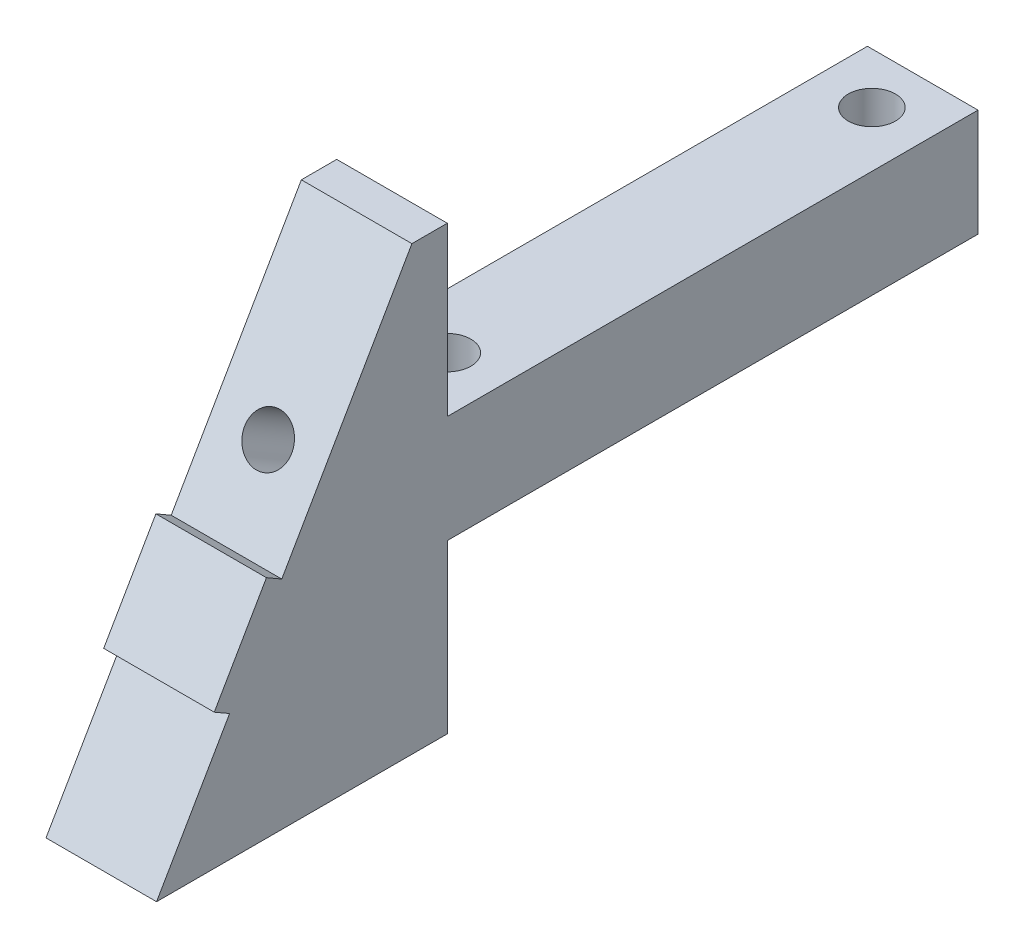
ISO-10303-21;
HEADER;
FILE_DESCRIPTION(('STEP AP214'),'2;1');
FILE_NAME('part.step','',(''),(''),'','','');
FILE_SCHEMA(('AUTOMOTIVE_DESIGN { 1 0 10303 214 1 1 1 1 }'));
ENDSEC;
DATA;
#1=APPLICATION_CONTEXT('core data for automotive mechanical design processes');
#2=APPLICATION_PROTOCOL_DEFINITION('international standard','automotive_design',2000,#1);
#3=PRODUCT_CONTEXT('',#1,'mechanical');
#4=PRODUCT('Part','Part','',(#3));
#5=PRODUCT_RELATED_PRODUCT_CATEGORY('part','',(#4));
#6=PRODUCT_DEFINITION_FORMATION('','',#4);
#7=PRODUCT_DEFINITION_CONTEXT('part definition',#1,'design');
#8=PRODUCT_DEFINITION('design','',#6,#7);
#9=PRODUCT_DEFINITION_SHAPE('','',#8);
#10=(LENGTH_UNIT() NAMED_UNIT(*) SI_UNIT(.MILLI.,.METRE.));
#11=(NAMED_UNIT(*) PLANE_ANGLE_UNIT() SI_UNIT($,.RADIAN.));
#12=(NAMED_UNIT(*) SI_UNIT($,.STERADIAN.) SOLID_ANGLE_UNIT());
#13=UNCERTAINTY_MEASURE_WITH_UNIT(LENGTH_MEASURE(1.E-05),#10,'distance_accuracy_value','');
#14=(GEOMETRIC_REPRESENTATION_CONTEXT(3) GLOBAL_UNCERTAINTY_ASSIGNED_CONTEXT((#13)) GLOBAL_UNIT_ASSIGNED_CONTEXT((#10,
#11,#12)) REPRESENTATION_CONTEXT('',''));
#15=CARTESIAN_POINT('',(0.,0.,0.));
#16=DIRECTION('',(0.,0.,1.));
#17=DIRECTION('',(1.,0.,0.));
#18=AXIS2_PLACEMENT_3D('',#15,#16,#17);
#19=CARTESIAN_POINT('',(0.,0.,-30.48));
#20=DIRECTION('',(0.,0.,-1.));
#21=DIRECTION('',(-1.,0.,0.));
#22=AXIS2_PLACEMENT_3D('',#19,#20,#21);
#23=PLANE('',#22);
#24=DIRECTION('',(0.,-1.,0.));
#25=VECTOR('',#24,1.);
#26=CARTESIAN_POINT('',(6.35,15.875,-30.48));
#27=LINE('',#26,#25);
#28=CARTESIAN_POINT('',(6.35,15.7861,-30.48));
#29=VERTEX_POINT('',#28);
#30=CARTESIAN_POINT('',(6.35,9.6139,-30.48));
#31=VERTEX_POINT('',#30);
#32=EDGE_CURVE('E178',#29,#31,#27,.T.);
#33=ORIENTED_EDGE('',*,*,#32,.T.);
#34=DIRECTION('',(1.,0.,0.));
#35=VECTOR('',#34,1.);
#36=CARTESIAN_POINT('',(6.35,9.6139,-30.48));
#37=LINE('',#36,#35);
#38=CARTESIAN_POINT('',(0.,9.6139,-30.48));
#39=VERTEX_POINT('',#38);
#40=EDGE_CURVE('E199',#39,#31,#37,.T.);
#41=ORIENTED_EDGE('',*,*,#40,.F.);
#42=DIRECTION('',(0.,1.,0.));
#43=VECTOR('',#42,1.);
#44=CARTESIAN_POINT('',(0.,15.875,-30.48));
#45=LINE('',#44,#43);
#46=CARTESIAN_POINT('',(0.,15.7861,-30.48));
#47=VERTEX_POINT('',#46);
#48=EDGE_CURVE('E181',#39,#47,#45,.T.);
#49=ORIENTED_EDGE('',*,*,#48,.T.);
#50=DIRECTION('',(-1.,0.,0.));
#51=VECTOR('',#50,1.);
#52=CARTESIAN_POINT('',(0.,15.7861,-30.48));
#53=LINE('',#52,#51);
#54=EDGE_CURVE('E218',#29,#47,#53,.T.);
#55=ORIENTED_EDGE('',*,*,#54,.F.);
#56=EDGE_LOOP('',(#33,#41,#49,#55));
#57=FACE_BOUND('',#56,.T.);
#58=ADVANCED_FACE('F39',(#57),#23,.T.);
#59=CARTESIAN_POINT('',(3.175,15.875,-27.559));
#60=DIRECTION('',(0.,1.,0.));
#61=DIRECTION('',(0.,0.,1.));
#62=AXIS2_PLACEMENT_3D('',#59,#60,#61);
#63=CYLINDRICAL_SURFACE('',#62,1.35254999999999);
#64=CARTESIAN_POINT('',(3.175,15.7861,-27.559));
#65=DIRECTION('',(0.,1.,0.));
#66=DIRECTION('',(0.,0.,1.));
#67=AXIS2_PLACEMENT_3D('',#64,#65,#66);
#68=CIRCLE('',#67,1.35254999999999);
#69=CARTESIAN_POINT('',(3.175,15.7861,-26.20645));
#70=VERTEX_POINT('',#69);
#71=EDGE_CURVE('E221',#70,#70,#68,.F.);
#72=ORIENTED_EDGE('',*,*,#71,.F.);
#73=EDGE_LOOP('',(#72));
#74=FACE_BOUND('',#73,.T.);
#75=CARTESIAN_POINT('',(3.175,9.6139,-27.559));
#76=DIRECTION('',(0.,-1.,0.));
#77=DIRECTION('',(0.,0.,-1.));
#78=AXIS2_PLACEMENT_3D('',#75,#76,#77);
#79=CIRCLE('',#78,1.35254999999999);
#80=CARTESIAN_POINT('',(3.175,9.6139,-28.91155));
#81=VERTEX_POINT('',#80);
#82=EDGE_CURVE('E206',#81,#81,#79,.F.);
#83=ORIENTED_EDGE('',*,*,#82,.F.);
#84=EDGE_LOOP('',(#83));
#85=FACE_BOUND('',#84,.T.);
#86=ADVANCED_FACE('F249',(#74,#85),#63,.F.);
#87=CARTESIAN_POINT('',(3.175,15.875,-3.175));
#88=DIRECTION('',(0.,1.,0.));
#89=DIRECTION('',(0.,0.,1.));
#90=AXIS2_PLACEMENT_3D('',#87,#88,#89);
#91=CYLINDRICAL_SURFACE('',#90,1.35254999999999);
#92=CARTESIAN_POINT('',(3.175,15.7861,-3.175));
#93=DIRECTION('',(0.,1.,0.));
#94=DIRECTION('',(0.,0.,1.));
#95=AXIS2_PLACEMENT_3D('',#92,#93,#94);
#96=CIRCLE('',#95,1.35254999999999);
#97=CARTESIAN_POINT('',(3.175,15.7861,-1.82245000000001));
#98=VERTEX_POINT('',#97);
#99=EDGE_CURVE('E43',#98,#98,#96,.F.);
#100=ORIENTED_EDGE('',*,*,#99,.F.);
#101=EDGE_LOOP('',(#100));
#102=FACE_BOUND('',#101,.T.);
#103=CARTESIAN_POINT('',(3.175,9.6139,-3.175));
#104=DIRECTION('',(0.,-1.,0.));
#105=DIRECTION('',(0.,0.,-1.));
#106=AXIS2_PLACEMENT_3D('',#103,#104,#105);
#107=CIRCLE('',#106,1.35254999999999);
#108=CARTESIAN_POINT('',(3.175,9.6139,-4.52754999999999));
#109=VERTEX_POINT('',#108);
#110=EDGE_CURVE('E203',#109,#109,#107,.F.);
#111=ORIENTED_EDGE('',*,*,#110,.F.);
#112=EDGE_LOOP('',(#111));
#113=FACE_BOUND('',#112,.T.);
#114=ADVANCED_FACE('F256',(#102,#113),#91,.F.);
#115=CARTESIAN_POINT('',(6.35,25.4,2.032));
#116=DIRECTION('',(0.,-0.499999999999995,-0.866025403784442));
#117=DIRECTION('',(0.,0.866025403784442,-0.499999999999995));
#118=AXIS2_PLACEMENT_3D('',#115,#116,#117);
#119=PLANE('',#118);
#120=DIRECTION('',(0.,-0.866025403784442,0.499999999999995));
#121=VECTOR('',#120,1.);
#122=CARTESIAN_POINT('',(6.35,25.4,2.032));
#123=LINE('',#122,#121);
#124=CARTESIAN_POINT('',(6.35,7.26343618632508,12.5031499999999));
#125=VERTEX_POINT('',#124);
#126=CARTESIAN_POINT('',(6.35,0.,16.6966968374163));
#127=VERTEX_POINT('',#126);
#128=EDGE_CURVE('E154',#125,#127,#123,.T.);
#129=ORIENTED_EDGE('',*,*,#128,.F.);
#130=DIRECTION('',(1.,0.,0.));
#131=VECTOR('',#130,1.);
#132=CARTESIAN_POINT('',(0.,7.26343618632508,12.5031499999999));
#133=LINE('',#132,#131);
#134=CARTESIAN_POINT('',(0.,7.26343618632508,12.5031499999999));
#135=VERTEX_POINT('',#134);
#136=EDGE_CURVE('E152',#135,#125,#133,.T.);
#137=ORIENTED_EDGE('',*,*,#136,.F.);
#138=DIRECTION('',(0.,-0.866025403784442,0.499999999999995));
#139=VECTOR('',#138,1.);
#140=CARTESIAN_POINT('',(0.,25.4,2.032));
#141=LINE('',#140,#139);
#142=CARTESIAN_POINT('',(0.,0.,16.6966968374163));
#143=VERTEX_POINT('',#142);
#144=EDGE_CURVE('E136',#135,#143,#141,.T.);
#145=ORIENTED_EDGE('',*,*,#144,.T.);
#146=DIRECTION('',(-1.,0.,0.));
#147=VECTOR('',#146,1.);
#148=CARTESIAN_POINT('',(6.35,0.,16.6966968374163));
#149=LINE('',#148,#147);
#150=EDGE_CURVE('E323',#127,#143,#149,.T.);
#151=ORIENTED_EDGE('',*,*,#150,.F.);
#152=EDGE_LOOP('',(#129,#137,#145,#151));
#153=FACE_BOUND('',#152,.T.);
#154=ADVANCED_FACE('F153',(#153),#119,.F.);
#155=CARTESIAN_POINT('',(3.175,16.6011818975501,7.11199999999995));
#156=DIRECTION('',(0.,0.499999999999995,0.866025403784442));
#157=DIRECTION('',(0.,-0.866025403784442,0.499999999999995));
#158=AXIS2_PLACEMENT_3D('',#155,#156,#157);
#159=CIRCLE('',#158,1.35254999999999);
#160=CARTESIAN_POINT('',(3.175,15.4298392376614,7.78827499999993));
#161=VERTEX_POINT('',#160);
#162=EDGE_CURVE('E223',#161,#161,#159,.T.);
#163=ORIENTED_EDGE('',*,*,#162,.F.);
#164=EDGE_LOOP('',(#163));
#165=FACE_BOUND('',#164,.T.);
#166=CARTESIAN_POINT('',(0.,25.4,2.032));
#167=VERTEX_POINT('',#166);
#168=CARTESIAN_POINT('',(0.,12.4547388667705,9.50594999999992));
#169=VERTEX_POINT('',#168);
#170=EDGE_CURVE('E149',#167,#169,#141,.T.);
#171=ORIENTED_EDGE('',*,*,#170,.T.);
#172=DIRECTION('',(-1.,0.,0.));
#173=VECTOR('',#172,1.);
#174=CARTESIAN_POINT('',(6.35,12.4547388667705,9.50594999999992));
#175=LINE('',#174,#173);
#176=CARTESIAN_POINT('',(6.35,12.4547388667705,9.50594999999992));
#177=VERTEX_POINT('',#176);
#178=EDGE_CURVE('E341',#177,#169,#175,.T.);
#179=ORIENTED_EDGE('',*,*,#178,.F.);
#180=CARTESIAN_POINT('',(6.35,25.4,2.032));
#181=VERTEX_POINT('',#180);
#182=EDGE_CURVE('E327',#181,#177,#123,.T.);
#183=ORIENTED_EDGE('',*,*,#182,.F.);
#184=DIRECTION('',(-1.,0.,0.));
#185=VECTOR('',#184,1.);
#186=CARTESIAN_POINT('',(6.35,25.4,2.032));
#187=LINE('',#186,#185);
#188=EDGE_CURVE('E326',#181,#167,#187,.T.);
#189=ORIENTED_EDGE('',*,*,#188,.T.);
#190=EDGE_LOOP('',(#171,#179,#183,#189));
#191=FACE_BOUND('',#190,.T.);
#192=ADVANCED_FACE('F269',(#165,#191),#119,.F.);
#193=CARTESIAN_POINT('',(6.35,0.,0.));
#194=DIRECTION('',(0.,0.,1.));
#195=DIRECTION('',(1.,0.,0.));
#196=AXIS2_PLACEMENT_3D('',#193,#194,#195);
#197=PLANE('',#196);
#198=DIRECTION('',(0.,1.,0.));
#199=VECTOR('',#198,1.);
#200=CARTESIAN_POINT('',(6.35,0.,0.));
#201=LINE('',#200,#199);
#202=CARTESIAN_POINT('',(6.35,15.7861,0.));
#203=VERTEX_POINT('',#202);
#204=CARTESIAN_POINT('',(6.35,25.4,0.));
#205=VERTEX_POINT('',#204);
#206=EDGE_CURVE('E284',#203,#205,#201,.T.);
#207=ORIENTED_EDGE('',*,*,#206,.F.);
#208=DIRECTION('',(1.,0.,0.));
#209=VECTOR('',#208,1.);
#210=CARTESIAN_POINT('',(0.,15.7861,0.));
#211=LINE('',#210,#209);
#212=CARTESIAN_POINT('',(0.,15.7861,0.));
#213=VERTEX_POINT('',#212);
#214=EDGE_CURVE('E213',#213,#203,#211,.T.);
#215=ORIENTED_EDGE('',*,*,#214,.F.);
#216=DIRECTION('',(0.,1.,0.));
#217=VECTOR('',#216,1.);
#218=CARTESIAN_POINT('',(0.,0.,0.));
#219=LINE('',#218,#217);
#220=CARTESIAN_POINT('',(0.,25.4,0.));
#221=VERTEX_POINT('',#220);
#222=EDGE_CURVE('E301',#213,#221,#219,.T.);
#223=ORIENTED_EDGE('',*,*,#222,.T.);
#224=DIRECTION('',(-1.,0.,0.));
#225=VECTOR('',#224,1.);
#226=CARTESIAN_POINT('',(6.35,25.4,0.));
#227=LINE('',#226,#225);
#228=EDGE_CURVE('E48',#205,#221,#227,.T.);
#229=ORIENTED_EDGE('',*,*,#228,.F.);
#230=EDGE_LOOP('',(#207,#215,#223,#229));
#231=FACE_BOUND('',#230,.T.);
#232=ADVANCED_FACE('F272',(#231),#197,.F.);
#233=CARTESIAN_POINT('',(0.,0.,0.));
#234=VERTEX_POINT('',#233);
#235=CARTESIAN_POINT('',(0.,9.6139,0.));
#236=VERTEX_POINT('',#235);
#237=EDGE_CURVE('E304',#234,#236,#219,.T.);
#238=ORIENTED_EDGE('',*,*,#237,.T.);
#239=DIRECTION('',(-1.,0.,0.));
#240=VECTOR('',#239,1.);
#241=CARTESIAN_POINT('',(6.35,9.6139,0.));
#242=LINE('',#241,#240);
#243=CARTESIAN_POINT('',(6.35,9.6139,0.));
#244=VERTEX_POINT('',#243);
#245=EDGE_CURVE('E200',#244,#236,#242,.T.);
#246=ORIENTED_EDGE('',*,*,#245,.F.);
#247=CARTESIAN_POINT('',(6.35,0.,0.));
#248=VERTEX_POINT('',#247);
#249=EDGE_CURVE('E288',#248,#244,#201,.T.);
#250=ORIENTED_EDGE('',*,*,#249,.F.);
#251=DIRECTION('',(-1.,0.,0.));
#252=VECTOR('',#251,1.);
#253=CARTESIAN_POINT('',(6.35,0.,0.));
#254=LINE('',#253,#252);
#255=EDGE_CURVE('E12',#248,#234,#254,.T.);
#256=ORIENTED_EDGE('',*,*,#255,.T.);
#257=EDGE_LOOP('',(#238,#246,#250,#256));
#258=FACE_BOUND('',#257,.T.);
#259=ADVANCED_FACE('F274',(#258),#197,.F.);
#260=CARTESIAN_POINT('',(6.35,0.,16.6966968374163));
#261=DIRECTION('',(0.,1.,0.));
#262=DIRECTION('',(0.,0.,1.));
#263=AXIS2_PLACEMENT_3D('',#260,#261,#262);
#264=PLANE('',#263);
#265=DIRECTION('',(0.,0.,-1.));
#266=VECTOR('',#265,1.);
#267=CARTESIAN_POINT('',(0.,0.,16.6966968374163));
#268=LINE('',#267,#266);
#269=EDGE_CURVE('E144',#143,#234,#268,.T.);
#270=ORIENTED_EDGE('',*,*,#269,.T.);
#271=ORIENTED_EDGE('',*,*,#255,.F.);
#272=DIRECTION('',(0.,0.,-1.));
#273=VECTOR('',#272,1.);
#274=CARTESIAN_POINT('',(6.35,0.,16.6966968374163));
#275=LINE('',#274,#273);
#276=EDGE_CURVE('E185',#127,#248,#275,.T.);
#277=ORIENTED_EDGE('',*,*,#276,.F.);
#278=ORIENTED_EDGE('',*,*,#150,.T.);
#279=EDGE_LOOP('',(#270,#271,#277,#278));
#280=FACE_BOUND('',#279,.T.);
#281=ADVANCED_FACE('F41',(#280),#264,.F.);
#282=CARTESIAN_POINT('',(6.35,25.4,0.));
#283=DIRECTION('',(0.,-1.,0.));
#284=DIRECTION('',(0.,0.,-1.));
#285=AXIS2_PLACEMENT_3D('',#282,#283,#284);
#286=PLANE('',#285);
#287=DIRECTION('',(0.,0.,1.));
#288=VECTOR('',#287,1.);
#289=CARTESIAN_POINT('',(0.,25.4,0.));
#290=LINE('',#289,#288);
#291=EDGE_CURVE('E150',#221,#167,#290,.T.);
#292=ORIENTED_EDGE('',*,*,#291,.T.);
#293=ORIENTED_EDGE('',*,*,#188,.F.);
#294=DIRECTION('',(0.,0.,1.));
#295=VECTOR('',#294,1.);
#296=CARTESIAN_POINT('',(6.35,25.4,0.));
#297=LINE('',#296,#295);
#298=EDGE_CURVE('E331',#205,#181,#297,.T.);
#299=ORIENTED_EDGE('',*,*,#298,.F.);
#300=ORIENTED_EDGE('',*,*,#228,.T.);
#301=EDGE_LOOP('',(#292,#293,#299,#300));
#302=FACE_BOUND('',#301,.T.);
#303=ADVANCED_FACE('F263',(#302),#286,.F.);
#304=CARTESIAN_POINT('',(6.35,0.,0.));
#305=DIRECTION('',(1.,0.,0.));
#306=DIRECTION('',(0.,0.,-1.));
#307=AXIS2_PLACEMENT_3D('',#304,#305,#306);
#308=PLANE('',#307);
#309=DIRECTION('',(0.,0.499999999999995,0.866025403784441));
#310=VECTOR('',#309,1.);
#311=CARTESIAN_POINT('',(6.35,7.26343618632508,12.5031499999999));
#312=LINE('',#311,#310);
#313=CARTESIAN_POINT('',(6.35,7.77143618632508,13.3830318102449));
#314=VERTEX_POINT('',#313);
#315=EDGE_CURVE('E56',#125,#314,#312,.T.);
#316=ORIENTED_EDGE('',*,*,#315,.F.);
#317=ORIENTED_EDGE('',*,*,#128,.T.);
#318=ORIENTED_EDGE('',*,*,#276,.T.);
#319=ORIENTED_EDGE('',*,*,#249,.T.);
#320=DIRECTION('',(0.,0.,1.));
#321=VECTOR('',#320,1.);
#322=CARTESIAN_POINT('',(6.35,9.6139,-30.48));
#323=LINE('',#322,#321);
#324=EDGE_CURVE('E296',#31,#244,#323,.T.);
#325=ORIENTED_EDGE('',*,*,#324,.F.);
#326=ORIENTED_EDGE('',*,*,#32,.F.);
#327=DIRECTION('',(0.,0.,-1.));
#328=VECTOR('',#327,1.);
#329=CARTESIAN_POINT('',(6.35,15.7861,-30.48));
#330=LINE('',#329,#328);
#331=EDGE_CURVE('E216',#203,#29,#330,.T.);
#332=ORIENTED_EDGE('',*,*,#331,.F.);
#333=ORIENTED_EDGE('',*,*,#206,.T.);
#334=ORIENTED_EDGE('',*,*,#298,.T.);
#335=ORIENTED_EDGE('',*,*,#182,.T.);
#336=DIRECTION('',(0.,-0.499999999999994,-0.866025403784442));
#337=VECTOR('',#336,1.);
#338=CARTESIAN_POINT('',(6.35,12.4547388667705,9.50594999999992));
#339=LINE('',#338,#337);
#340=CARTESIAN_POINT('',(6.35,12.9627388667705,10.3858318102449));
#341=VERTEX_POINT('',#340);
#342=EDGE_CURVE('E339',#341,#177,#339,.T.);
#343=ORIENTED_EDGE('',*,*,#342,.F.);
#344=DIRECTION('',(0.,0.866025403784442,-0.499999999999995));
#345=VECTOR('',#344,1.);
#346=CARTESIAN_POINT('',(6.35,13.039728525167,10.3413818102449));
#347=LINE('',#346,#345);
#348=EDGE_CURVE('E174',#314,#341,#347,.T.);
#349=ORIENTED_EDGE('',*,*,#348,.F.);
#350=EDGE_LOOP('',(#316,#317,#318,#319,#325,#326,#332,#333,#334,#335,#343,#349));
#351=FACE_BOUND('',#350,.T.);
#352=ADVANCED_FACE('F260',(#351),#308,.T.);
#353=CARTESIAN_POINT('',(0.,0.,0.));
#354=DIRECTION('',(1.,0.,0.));
#355=DIRECTION('',(0.,0.,-1.));
#356=AXIS2_PLACEMENT_3D('',#353,#354,#355);
#357=PLANE('',#356);
#358=ORIENTED_EDGE('',*,*,#144,.F.);
#359=DIRECTION('',(0.,-0.499999999999995,-0.866025403784441));
#360=VECTOR('',#359,1.);
#361=CARTESIAN_POINT('',(0.,7.26343618632508,12.5031499999999));
#362=LINE('',#361,#360);
#363=CARTESIAN_POINT('',(0.,7.77143618632508,13.3830318102449));
#364=VERTEX_POINT('',#363);
#365=EDGE_CURVE('E141',#364,#135,#362,.T.);
#366=ORIENTED_EDGE('',*,*,#365,.F.);
#367=DIRECTION('',(0.,-0.866025403784442,0.499999999999995));
#368=VECTOR('',#367,1.);
#369=CARTESIAN_POINT('',(0.,13.039728525167,10.3413818102449));
#370=LINE('',#369,#368);
#371=CARTESIAN_POINT('',(0.,12.9627388667705,10.3858318102449));
#372=VERTEX_POINT('',#371);
#373=EDGE_CURVE('E170',#372,#364,#370,.T.);
#374=ORIENTED_EDGE('',*,*,#373,.F.);
#375=DIRECTION('',(0.,0.499999999999994,0.866025403784442));
#376=VECTOR('',#375,1.);
#377=CARTESIAN_POINT('',(0.,12.4547388667705,9.50594999999992));
#378=LINE('',#377,#376);
#379=EDGE_CURVE('E64',#169,#372,#378,.T.);
#380=ORIENTED_EDGE('',*,*,#379,.F.);
#381=ORIENTED_EDGE('',*,*,#170,.F.);
#382=ORIENTED_EDGE('',*,*,#291,.F.);
#383=ORIENTED_EDGE('',*,*,#222,.F.);
#384=DIRECTION('',(0.,0.,1.));
#385=VECTOR('',#384,1.);
#386=CARTESIAN_POINT('',(0.,15.7861,-30.48));
#387=LINE('',#386,#385);
#388=EDGE_CURVE('E208',#47,#213,#387,.T.);
#389=ORIENTED_EDGE('',*,*,#388,.F.);
#390=ORIENTED_EDGE('',*,*,#48,.F.);
#391=DIRECTION('',(0.,0.,-1.));
#392=VECTOR('',#391,1.);
#393=CARTESIAN_POINT('',(0.,9.6139,-30.48));
#394=LINE('',#393,#392);
#395=EDGE_CURVE('E194',#236,#39,#394,.T.);
#396=ORIENTED_EDGE('',*,*,#395,.F.);
#397=ORIENTED_EDGE('',*,*,#237,.F.);
#398=ORIENTED_EDGE('',*,*,#269,.F.);
#399=EDGE_LOOP('',(#358,#366,#374,#380,#381,#382,#383,#389,#390,#396,#397,#398));
#400=FACE_BOUND('',#399,.T.);
#401=ADVANCED_FACE('F138',(#400),#357,.F.);
#402=CARTESIAN_POINT('',(0.,7.73788181024485,13.4024044383073));
#403=DIRECTION('',(0.,0.499999999999995,0.866025403784442));
#404=DIRECTION('',(0.,-0.866025403784442,0.499999999999995));
#405=AXIS2_PLACEMENT_3D('',#402,#403,#404);
#406=PLANE('',#405);
#407=DIRECTION('',(-1.,0.,0.));
#408=VECTOR('',#407,1.);
#409=CARTESIAN_POINT('',(0.,7.77143618632508,13.3830318102449));
#410=LINE('',#409,#408);
#411=EDGE_CURVE('E157',#314,#364,#410,.T.);
#412=ORIENTED_EDGE('',*,*,#411,.F.);
#413=ORIENTED_EDGE('',*,*,#348,.T.);
#414=DIRECTION('',(1.,0.,0.));
#415=VECTOR('',#414,1.);
#416=CARTESIAN_POINT('',(6.35,12.9627388667705,10.3858318102449));
#417=LINE('',#416,#415);
#418=EDGE_CURVE('E344',#372,#341,#417,.T.);
#419=ORIENTED_EDGE('',*,*,#418,.F.);
#420=ORIENTED_EDGE('',*,*,#373,.T.);
#421=EDGE_LOOP('',(#412,#413,#419,#420));
#422=FACE_BOUND('',#421,.T.);
#423=ADVANCED_FACE('F244',(#422),#406,.T.);
#424=CARTESIAN_POINT('',(3.175,13.4261818975501,1.61273868596875));
#425=DIRECTION('',(0.,0.499999999999995,0.866025403784442));
#426=DIRECTION('',(0.,-0.866025403784442,0.499999999999995));
#427=AXIS2_PLACEMENT_3D('',#424,#425,#426);
#428=CONICAL_SURFACE('',#427,1.35254999999999,1.02974425867665);
#429=CARTESIAN_POINT('',(3.175,13.0198348824172,0.908925010254667));
#430=VERTEX_POINT('',#429);
#431=VERTEX_LOOP('',#430);
#432=FACE_BOUND('',#431,.T.);
#433=CARTESIAN_POINT('',(3.175,13.4261818975501,1.61273868596875));
#434=DIRECTION('',(0.,0.499999999999995,0.866025403784442));
#435=DIRECTION('',(0.,-0.866025403784442,0.499999999999995));
#436=AXIS2_PLACEMENT_3D('',#433,#434,#435);
#437=CIRCLE('',#436,1.35254999999999);
#438=CARTESIAN_POINT('',(3.175,12.2548392376615,2.28901368596873));
#439=VERTEX_POINT('',#438);
#440=EDGE_CURVE('E175',#439,#439,#437,.T.);
#441=ORIENTED_EDGE('',*,*,#440,.T.);
#442=EDGE_LOOP('',(#441));
#443=FACE_BOUND('',#442,.T.);
#444=ADVANCED_FACE('F230',(#432,#443),#428,.F.);
#445=CARTESIAN_POINT('',(3.175,16.6011818975501,7.11199999999995));
#446=DIRECTION('',(0.,0.499999999999995,0.866025403784442));
#447=DIRECTION('',(0.,-0.866025403784442,0.499999999999995));
#448=AXIS2_PLACEMENT_3D('',#445,#446,#447);
#449=CYLINDRICAL_SURFACE('',#448,1.35254999999999);
#450=ORIENTED_EDGE('',*,*,#440,.F.);
#451=EDGE_LOOP('',(#450));
#452=FACE_BOUND('',#451,.T.);
#453=ORIENTED_EDGE('',*,*,#162,.T.);
#454=EDGE_LOOP('',(#453));
#455=FACE_BOUND('',#454,.T.);
#456=ADVANCED_FACE('F232',(#452,#455),#449,.F.);
#457=CARTESIAN_POINT('',(0.,15.7861,0.));
#458=DIRECTION('',(0.,1.,0.));
#459=DIRECTION('',(0.,0.,1.));
#460=AXIS2_PLACEMENT_3D('',#457,#458,#459);
#461=PLANE('',#460);
#462=ORIENTED_EDGE('',*,*,#99,.T.);
#463=EDGE_LOOP('',(#462));
#464=FACE_BOUND('',#463,.T.);
#465=ORIENTED_EDGE('',*,*,#388,.T.);
#466=ORIENTED_EDGE('',*,*,#214,.T.);
#467=ORIENTED_EDGE('',*,*,#331,.T.);
#468=ORIENTED_EDGE('',*,*,#54,.T.);
#469=EDGE_LOOP('',(#465,#466,#467,#468));
#470=FACE_BOUND('',#469,.T.);
#471=ORIENTED_EDGE('',*,*,#71,.T.);
#472=EDGE_LOOP('',(#471));
#473=FACE_BOUND('',#472,.T.);
#474=ADVANCED_FACE('F234',(#464,#470,#473),#461,.T.);
#475=CARTESIAN_POINT('',(0.,9.6139,0.));
#476=DIRECTION('',(0.,-1.,0.));
#477=DIRECTION('',(0.,0.,-1.));
#478=AXIS2_PLACEMENT_3D('',#475,#476,#477);
#479=PLANE('',#478);
#480=ORIENTED_EDGE('',*,*,#110,.T.);
#481=EDGE_LOOP('',(#480));
#482=FACE_BOUND('',#481,.T.);
#483=ORIENTED_EDGE('',*,*,#324,.T.);
#484=ORIENTED_EDGE('',*,*,#245,.T.);
#485=ORIENTED_EDGE('',*,*,#395,.T.);
#486=ORIENTED_EDGE('',*,*,#40,.T.);
#487=EDGE_LOOP('',(#483,#484,#485,#486));
#488=FACE_BOUND('',#487,.T.);
#489=ORIENTED_EDGE('',*,*,#82,.T.);
#490=EDGE_LOOP('',(#489));
#491=FACE_BOUND('',#490,.T.);
#492=ADVANCED_FACE('F241',(#482,#488,#491),#479,.T.);
#493=CARTESIAN_POINT('',(0.,5.2248570565257,-3.01657262806238));
#494=DIRECTION('',(0.,-0.866025403784442,0.499999999999994));
#495=DIRECTION('',(0.,-0.499999999999994,-0.866025403784442));
#496=AXIS2_PLACEMENT_3D('',#493,#494,#495);
#497=PLANE('',#496);
#498=ORIENTED_EDGE('',*,*,#342,.T.);
#499=ORIENTED_EDGE('',*,*,#178,.T.);
#500=ORIENTED_EDGE('',*,*,#379,.T.);
#501=ORIENTED_EDGE('',*,*,#418,.T.);
#502=EDGE_LOOP('',(#498,#499,#500,#501));
#503=FACE_BOUND('',#502,.T.);
#504=ADVANCED_FACE('F343',(#503),#497,.F.);
#505=CARTESIAN_POINT('',(0.,0.03355437608023,-0.0193726280624105));
#506=DIRECTION('',(0.,0.866025403784442,-0.499999999999995));
#507=DIRECTION('',(0.,0.499999999999995,0.866025403784442));
#508=AXIS2_PLACEMENT_3D('',#505,#506,#507);
#509=PLANE('',#508);
#510=ORIENTED_EDGE('',*,*,#365,.T.);
#511=ORIENTED_EDGE('',*,*,#136,.T.);
#512=ORIENTED_EDGE('',*,*,#315,.T.);
#513=ORIENTED_EDGE('',*,*,#411,.T.);
#514=EDGE_LOOP('',(#510,#511,#512,#513));
#515=FACE_BOUND('',#514,.T.);
#516=ADVANCED_FACE('F156',(#515),#509,.F.);
#517=CLOSED_SHELL('',(#58,#86,#114,#154,#192,#232,#259,#281,#303,#352,#401,#423,#444,#456,#474,
#492,#504,#516));
#518=MANIFOLD_SOLID_BREP('B2',#517);
#519=ADVANCED_BREP_SHAPE_REPRESENTATION('',(#18,#518),#14);
#520=SHAPE_DEFINITION_REPRESENTATION(#9,#519);
ENDSEC;
END-ISO-10303-21;
